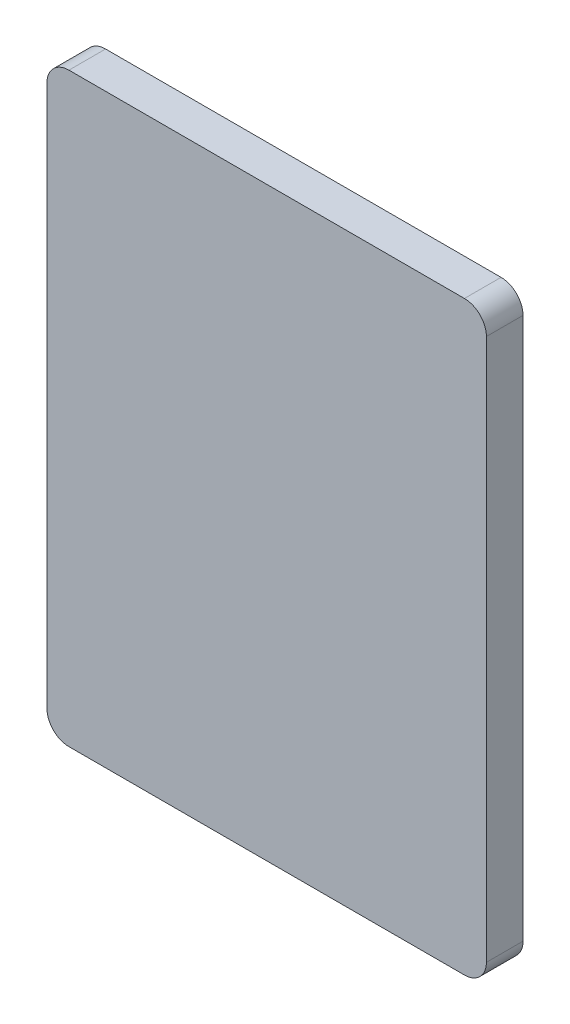
ISO-10303-21;
HEADER;
FILE_DESCRIPTION(('STEP AP214'),'2;1');
FILE_NAME('part.step','',(''),(''),'','','');
FILE_SCHEMA(('AUTOMOTIVE_DESIGN { 1 0 10303 214 1 1 1 1 }'));
ENDSEC;
DATA;
#1=APPLICATION_CONTEXT('core data for automotive mechanical design processes');
#2=APPLICATION_PROTOCOL_DEFINITION('international standard','automotive_design',2000,#1);
#3=PRODUCT_CONTEXT('',#1,'mechanical');
#4=PRODUCT('Part','Part','',(#3));
#5=PRODUCT_RELATED_PRODUCT_CATEGORY('part','',(#4));
#6=PRODUCT_DEFINITION_FORMATION('','',#4);
#7=PRODUCT_DEFINITION_CONTEXT('part definition',#1,'design');
#8=PRODUCT_DEFINITION('design','',#6,#7);
#9=PRODUCT_DEFINITION_SHAPE('','',#8);
#10=(LENGTH_UNIT() NAMED_UNIT(*) SI_UNIT(.MILLI.,.METRE.));
#11=(NAMED_UNIT(*) PLANE_ANGLE_UNIT() SI_UNIT($,.RADIAN.));
#12=(NAMED_UNIT(*) SI_UNIT($,.STERADIAN.) SOLID_ANGLE_UNIT());
#13=UNCERTAINTY_MEASURE_WITH_UNIT(LENGTH_MEASURE(1.E-05),#10,'distance_accuracy_value','');
#14=(GEOMETRIC_REPRESENTATION_CONTEXT(3) GLOBAL_UNCERTAINTY_ASSIGNED_CONTEXT((#13)) GLOBAL_UNIT_ASSIGNED_CONTEXT((#10,
#11,#12)) REPRESENTATION_CONTEXT('',''));
#15=CARTESIAN_POINT('',(0.,0.,0.));
#16=DIRECTION('',(0.,0.,1.));
#17=DIRECTION('',(1.,0.,0.));
#18=AXIS2_PLACEMENT_3D('',#15,#16,#17);
#19=CARTESIAN_POINT('',(-30.,-40.,5.));
#20=DIRECTION('',(1.,0.,0.));
#21=DIRECTION('',(0.,0.,-1.));
#22=AXIS2_PLACEMENT_3D('',#19,#20,#21);
#23=PLANE('',#22);
#24=DIRECTION('',(0.,-1.,0.));
#25=VECTOR('',#24,1.);
#26=CARTESIAN_POINT('',(-30.,-40.,0.));
#27=LINE('',#26,#25);
#28=CARTESIAN_POINT('',(-30.,37.,0.));
#29=VERTEX_POINT('',#28);
#30=CARTESIAN_POINT('',(-30.,-37.,0.));
#31=VERTEX_POINT('',#30);
#32=EDGE_CURVE('E130',#29,#31,#27,.T.);
#33=ORIENTED_EDGE('',*,*,#32,.T.);
#34=DIRECTION('',(0.,0.,-1.));
#35=VECTOR('',#34,1.);
#36=CARTESIAN_POINT('',(-30.,-37.,5.));
#37=LINE('',#36,#35);
#38=CARTESIAN_POINT('',(-30.,-37.,5.));
#39=VERTEX_POINT('',#38);
#40=EDGE_CURVE('E153',#31,#39,#37,.F.);
#41=ORIENTED_EDGE('',*,*,#40,.T.);
#42=DIRECTION('',(0.,-1.,0.));
#43=VECTOR('',#42,1.);
#44=CARTESIAN_POINT('',(-30.,-40.,5.));
#45=LINE('',#44,#43);
#46=CARTESIAN_POINT('',(-30.,37.,5.));
#47=VERTEX_POINT('',#46);
#48=EDGE_CURVE('E128',#47,#39,#45,.T.);
#49=ORIENTED_EDGE('',*,*,#48,.F.);
#50=DIRECTION('',(0.,0.,-1.));
#51=VECTOR('',#50,1.);
#52=CARTESIAN_POINT('',(-30.,37.,5.));
#53=LINE('',#52,#51);
#54=EDGE_CURVE('E150',#47,#29,#53,.T.);
#55=ORIENTED_EDGE('',*,*,#54,.T.);
#56=EDGE_LOOP('',(#33,#41,#49,#55));
#57=FACE_BOUND('',#56,.T.);
#58=ADVANCED_FACE('F35',(#57),#23,.F.);
#59=CARTESIAN_POINT('',(30.,-40.,5.));
#60=DIRECTION('',(0.,1.,0.));
#61=DIRECTION('',(-1.,0.,0.));
#62=AXIS2_PLACEMENT_3D('',#59,#60,#61);
#63=PLANE('',#62);
#64=DIRECTION('',(1.,0.,0.));
#65=VECTOR('',#64,1.);
#66=CARTESIAN_POINT('',(30.,-40.,0.));
#67=LINE('',#66,#65);
#68=CARTESIAN_POINT('',(-27.,-40.,0.));
#69=VERTEX_POINT('',#68);
#70=CARTESIAN_POINT('',(27.,-40.,0.));
#71=VERTEX_POINT('',#70);
#72=EDGE_CURVE('E126',#69,#71,#67,.T.);
#73=ORIENTED_EDGE('',*,*,#72,.T.);
#74=DIRECTION('',(0.,0.,-1.));
#75=VECTOR('',#74,1.);
#76=CARTESIAN_POINT('',(27.,-40.,5.));
#77=LINE('',#76,#75);
#78=CARTESIAN_POINT('',(27.,-40.,5.));
#79=VERTEX_POINT('',#78);
#80=EDGE_CURVE('E105',#71,#79,#77,.F.);
#81=ORIENTED_EDGE('',*,*,#80,.T.);
#82=DIRECTION('',(1.,0.,0.));
#83=VECTOR('',#82,1.);
#84=CARTESIAN_POINT('',(30.,-40.,5.));
#85=LINE('',#84,#83);
#86=CARTESIAN_POINT('',(-27.,-40.,5.));
#87=VERTEX_POINT('',#86);
#88=EDGE_CURVE('E169',#87,#79,#85,.T.);
#89=ORIENTED_EDGE('',*,*,#88,.F.);
#90=DIRECTION('',(0.,0.,-1.));
#91=VECTOR('',#90,1.);
#92=CARTESIAN_POINT('',(-27.,-40.,5.));
#93=LINE('',#92,#91);
#94=EDGE_CURVE('E110',#87,#69,#93,.T.);
#95=ORIENTED_EDGE('',*,*,#94,.T.);
#96=EDGE_LOOP('',(#73,#81,#89,#95));
#97=FACE_BOUND('',#96,.T.);
#98=ADVANCED_FACE('F186',(#97),#63,.F.);
#99=CARTESIAN_POINT('',(30.,-40.,5.));
#100=DIRECTION('',(-1.,0.,0.));
#101=DIRECTION('',(0.,0.,1.));
#102=AXIS2_PLACEMENT_3D('',#99,#100,#101);
#103=PLANE('',#102);
#104=DIRECTION('',(0.,1.,0.));
#105=VECTOR('',#104,1.);
#106=CARTESIAN_POINT('',(30.,-40.,5.));
#107=LINE('',#106,#105);
#108=CARTESIAN_POINT('',(30.,-37.,5.));
#109=VERTEX_POINT('',#108);
#110=CARTESIAN_POINT('',(30.,37.,5.));
#111=VERTEX_POINT('',#110);
#112=EDGE_CURVE('E119',#109,#111,#107,.T.);
#113=ORIENTED_EDGE('',*,*,#112,.F.);
#114=DIRECTION('',(0.,0.,-1.));
#115=VECTOR('',#114,1.);
#116=CARTESIAN_POINT('',(30.,-37.,5.));
#117=LINE('',#116,#115);
#118=CARTESIAN_POINT('',(30.,-37.,0.));
#119=VERTEX_POINT('',#118);
#120=EDGE_CURVE('E104',#109,#119,#117,.T.);
#121=ORIENTED_EDGE('',*,*,#120,.T.);
#122=DIRECTION('',(0.,1.,0.));
#123=VECTOR('',#122,1.);
#124=CARTESIAN_POINT('',(30.,-40.,0.));
#125=LINE('',#124,#123);
#126=CARTESIAN_POINT('',(30.,37.,0.));
#127=VERTEX_POINT('',#126);
#128=EDGE_CURVE('E117',#119,#127,#125,.T.);
#129=ORIENTED_EDGE('',*,*,#128,.T.);
#130=DIRECTION('',(0.,0.,-1.));
#131=VECTOR('',#130,1.);
#132=CARTESIAN_POINT('',(30.,37.,5.));
#133=LINE('',#132,#131);
#134=EDGE_CURVE('E121',#127,#111,#133,.F.);
#135=ORIENTED_EDGE('',*,*,#134,.T.);
#136=EDGE_LOOP('',(#113,#121,#129,#135));
#137=FACE_BOUND('',#136,.T.);
#138=ADVANCED_FACE('F116',(#137),#103,.F.);
#139=CARTESIAN_POINT('',(30.,40.,5.));
#140=DIRECTION('',(0.,-1.,0.));
#141=DIRECTION('',(1.,0.,0.));
#142=AXIS2_PLACEMENT_3D('',#139,#140,#141);
#143=PLANE('',#142);
#144=DIRECTION('',(-1.,0.,0.));
#145=VECTOR('',#144,1.);
#146=CARTESIAN_POINT('',(30.,40.,0.));
#147=LINE('',#146,#145);
#148=CARTESIAN_POINT('',(27.,40.,0.));
#149=VERTEX_POINT('',#148);
#150=CARTESIAN_POINT('',(-27.,40.,0.));
#151=VERTEX_POINT('',#150);
#152=EDGE_CURVE('E125',#149,#151,#147,.T.);
#153=ORIENTED_EDGE('',*,*,#152,.T.);
#154=DIRECTION('',(0.,0.,-1.));
#155=VECTOR('',#154,1.);
#156=CARTESIAN_POINT('',(-27.,40.,5.));
#157=LINE('',#156,#155);
#158=CARTESIAN_POINT('',(-27.,40.,5.));
#159=VERTEX_POINT('',#158);
#160=EDGE_CURVE('E11',#151,#159,#157,.F.);
#161=ORIENTED_EDGE('',*,*,#160,.T.);
#162=DIRECTION('',(-1.,0.,0.));
#163=VECTOR('',#162,1.);
#164=CARTESIAN_POINT('',(30.,40.,5.));
#165=LINE('',#164,#163);
#166=CARTESIAN_POINT('',(27.,40.,5.));
#167=VERTEX_POINT('',#166);
#168=EDGE_CURVE('E134',#167,#159,#165,.T.);
#169=ORIENTED_EDGE('',*,*,#168,.F.);
#170=DIRECTION('',(0.,0.,-1.));
#171=VECTOR('',#170,1.);
#172=CARTESIAN_POINT('',(27.,40.,5.));
#173=LINE('',#172,#171);
#174=EDGE_CURVE('E43',#167,#149,#173,.T.);
#175=ORIENTED_EDGE('',*,*,#174,.T.);
#176=EDGE_LOOP('',(#153,#161,#169,#175));
#177=FACE_BOUND('',#176,.T.);
#178=ADVANCED_FACE('F156',(#177),#143,.F.);
#179=CARTESIAN_POINT('',(0.,0.,5.));
#180=DIRECTION('',(0.,0.,1.));
#181=DIRECTION('',(1.,0.,0.));
#182=AXIS2_PLACEMENT_3D('',#179,#180,#181);
#183=PLANE('',#182);
#184=ORIENTED_EDGE('',*,*,#88,.T.);
#185=CARTESIAN_POINT('',(27.,-37.,5.));
#186=DIRECTION('',(0.,0.,1.));
#187=DIRECTION('',(1.,0.,0.));
#188=AXIS2_PLACEMENT_3D('',#185,#186,#187);
#189=CIRCLE('',#188,3.);
#190=EDGE_CURVE('E148',#79,#109,#189,.T.);
#191=ORIENTED_EDGE('',*,*,#190,.T.);
#192=ORIENTED_EDGE('',*,*,#112,.T.);
#193=CARTESIAN_POINT('',(27.,37.,5.));
#194=DIRECTION('',(0.,0.,1.));
#195=DIRECTION('',(1.,0.,0.));
#196=AXIS2_PLACEMENT_3D('',#193,#194,#195);
#197=CIRCLE('',#196,3.);
#198=EDGE_CURVE('E55',#111,#167,#197,.T.);
#199=ORIENTED_EDGE('',*,*,#198,.T.);
#200=ORIENTED_EDGE('',*,*,#168,.T.);
#201=CARTESIAN_POINT('',(-27.,37.,5.));
#202=DIRECTION('',(0.,0.,1.));
#203=DIRECTION('',(1.,0.,0.));
#204=AXIS2_PLACEMENT_3D('',#201,#202,#203);
#205=CIRCLE('',#204,3.);
#206=EDGE_CURVE('E144',#159,#47,#205,.T.);
#207=ORIENTED_EDGE('',*,*,#206,.T.);
#208=ORIENTED_EDGE('',*,*,#48,.T.);
#209=CARTESIAN_POINT('',(-27.,-37.,5.));
#210=DIRECTION('',(0.,0.,1.));
#211=DIRECTION('',(1.,0.,0.));
#212=AXIS2_PLACEMENT_3D('',#209,#210,#211);
#213=CIRCLE('',#212,3.);
#214=EDGE_CURVE('E146',#39,#87,#213,.T.);
#215=ORIENTED_EDGE('',*,*,#214,.T.);
#216=EDGE_LOOP('',(#184,#191,#192,#199,#200,#207,#208,#215));
#217=FACE_BOUND('',#216,.T.);
#218=ADVANCED_FACE('F175',(#217),#183,.T.);
#219=CARTESIAN_POINT('',(0.,0.,0.));
#220=DIRECTION('',(0.,0.,1.));
#221=DIRECTION('',(1.,0.,0.));
#222=AXIS2_PLACEMENT_3D('',#219,#220,#221);
#223=PLANE('',#222);
#224=ORIENTED_EDGE('',*,*,#128,.F.);
#225=CARTESIAN_POINT('',(27.,-37.,0.));
#226=DIRECTION('',(0.,0.,1.));
#227=DIRECTION('',(1.,0.,0.));
#228=AXIS2_PLACEMENT_3D('',#225,#226,#227);
#229=CIRCLE('',#228,3.);
#230=EDGE_CURVE('E100',#119,#71,#229,.F.);
#231=ORIENTED_EDGE('',*,*,#230,.T.);
#232=ORIENTED_EDGE('',*,*,#72,.F.);
#233=CARTESIAN_POINT('',(-27.,-37.,0.));
#234=DIRECTION('',(0.,0.,1.));
#235=DIRECTION('',(1.,0.,0.));
#236=AXIS2_PLACEMENT_3D('',#233,#234,#235);
#237=CIRCLE('',#236,3.);
#238=EDGE_CURVE('E111',#69,#31,#237,.F.);
#239=ORIENTED_EDGE('',*,*,#238,.T.);
#240=ORIENTED_EDGE('',*,*,#32,.F.);
#241=CARTESIAN_POINT('',(-27.,37.,0.));
#242=DIRECTION('',(0.,0.,1.));
#243=DIRECTION('',(1.,0.,0.));
#244=AXIS2_PLACEMENT_3D('',#241,#242,#243);
#245=CIRCLE('',#244,3.);
#246=EDGE_CURVE('E137',#29,#151,#245,.F.);
#247=ORIENTED_EDGE('',*,*,#246,.T.);
#248=ORIENTED_EDGE('',*,*,#152,.F.);
#249=CARTESIAN_POINT('',(27.,37.,0.));
#250=DIRECTION('',(0.,0.,1.));
#251=DIRECTION('',(1.,0.,0.));
#252=AXIS2_PLACEMENT_3D('',#249,#250,#251);
#253=CIRCLE('',#252,3.);
#254=EDGE_CURVE('E120',#149,#127,#253,.F.);
#255=ORIENTED_EDGE('',*,*,#254,.T.);
#256=EDGE_LOOP('',(#224,#231,#232,#239,#240,#247,#248,#255));
#257=FACE_BOUND('',#256,.T.);
#258=ADVANCED_FACE('F123',(#257),#223,.F.);
#259=CARTESIAN_POINT('',(27.,-37.,5.));
#260=DIRECTION('',(0.,0.,-1.));
#261=DIRECTION('',(-1.,0.,0.));
#262=AXIS2_PLACEMENT_3D('',#259,#260,#261);
#263=CYLINDRICAL_SURFACE('',#262,3.);
#264=ORIENTED_EDGE('',*,*,#190,.F.);
#265=ORIENTED_EDGE('',*,*,#80,.F.);
#266=ORIENTED_EDGE('',*,*,#230,.F.);
#267=ORIENTED_EDGE('',*,*,#120,.F.);
#268=EDGE_LOOP('',(#264,#265,#266,#267));
#269=FACE_BOUND('',#268,.T.);
#270=ADVANCED_FACE('F103',(#269),#263,.T.);
#271=CARTESIAN_POINT('',(-27.,-37.,5.));
#272=DIRECTION('',(0.,0.,-1.));
#273=DIRECTION('',(-1.,0.,0.));
#274=AXIS2_PLACEMENT_3D('',#271,#272,#273);
#275=CYLINDRICAL_SURFACE('',#274,3.);
#276=ORIENTED_EDGE('',*,*,#214,.F.);
#277=ORIENTED_EDGE('',*,*,#40,.F.);
#278=ORIENTED_EDGE('',*,*,#238,.F.);
#279=ORIENTED_EDGE('',*,*,#94,.F.);
#280=EDGE_LOOP('',(#276,#277,#278,#279));
#281=FACE_BOUND('',#280,.T.);
#282=ADVANCED_FACE('F197',(#281),#275,.T.);
#283=CARTESIAN_POINT('',(-27.,37.,5.));
#284=DIRECTION('',(0.,0.,-1.));
#285=DIRECTION('',(-1.,0.,0.));
#286=AXIS2_PLACEMENT_3D('',#283,#284,#285);
#287=CYLINDRICAL_SURFACE('',#286,3.);
#288=ORIENTED_EDGE('',*,*,#206,.F.);
#289=ORIENTED_EDGE('',*,*,#160,.F.);
#290=ORIENTED_EDGE('',*,*,#246,.F.);
#291=ORIENTED_EDGE('',*,*,#54,.F.);
#292=EDGE_LOOP('',(#288,#289,#290,#291));
#293=FACE_BOUND('',#292,.T.);
#294=ADVANCED_FACE('F163',(#293),#287,.T.);
#295=CARTESIAN_POINT('',(27.,37.,5.));
#296=DIRECTION('',(0.,0.,-1.));
#297=DIRECTION('',(-1.,0.,0.));
#298=AXIS2_PLACEMENT_3D('',#295,#296,#297);
#299=CYLINDRICAL_SURFACE('',#298,3.);
#300=ORIENTED_EDGE('',*,*,#198,.F.);
#301=ORIENTED_EDGE('',*,*,#134,.F.);
#302=ORIENTED_EDGE('',*,*,#254,.F.);
#303=ORIENTED_EDGE('',*,*,#174,.F.);
#304=EDGE_LOOP('',(#300,#301,#302,#303));
#305=FACE_BOUND('',#304,.T.);
#306=ADVANCED_FACE('F37',(#305),#299,.T.);
#307=CLOSED_SHELL('',(#58,#98,#138,#178,#218,#258,#270,#282,#294,#306));
#308=MANIFOLD_SOLID_BREP('B2',#307);
#309=ADVANCED_BREP_SHAPE_REPRESENTATION('',(#18,#308),#14);
#310=SHAPE_DEFINITION_REPRESENTATION(#9,#309);
ENDSEC;
END-ISO-10303-21;
